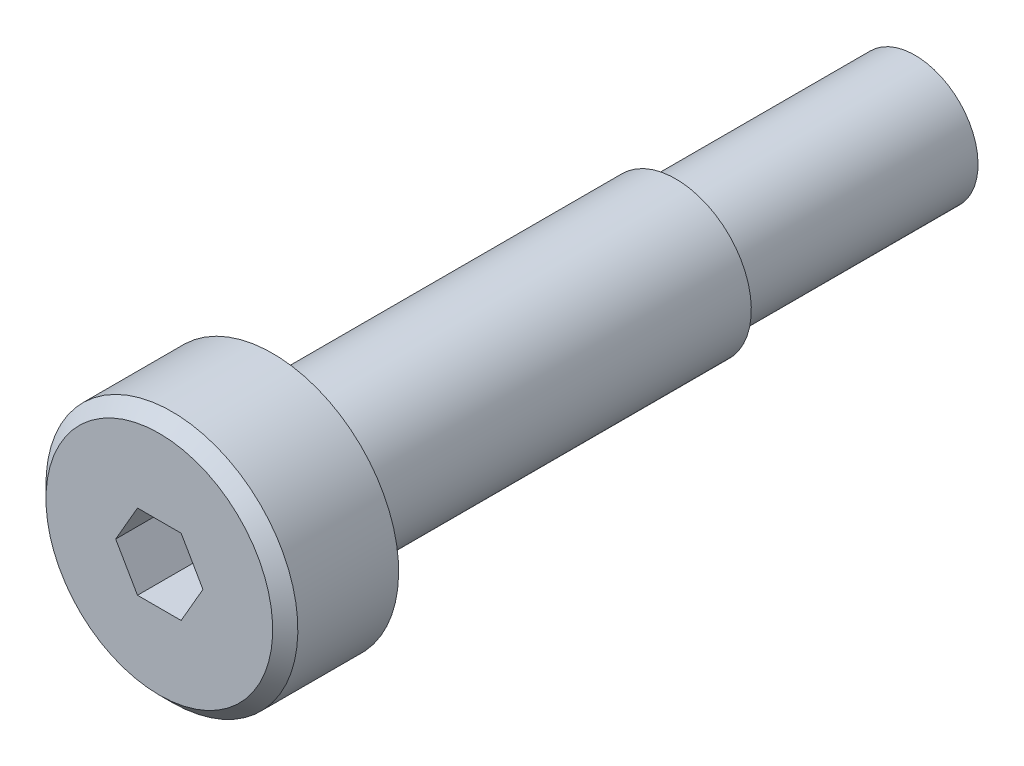
ISO-10303-21;
HEADER;
FILE_DESCRIPTION(('STEP AP214'),'2;1');
FILE_NAME('part.step','',(''),(''),'','','');
FILE_SCHEMA(('AUTOMOTIVE_DESIGN { 1 0 10303 214 1 1 1 1 }'));
ENDSEC;
DATA;
#1=APPLICATION_CONTEXT('core data for automotive mechanical design processes');
#2=APPLICATION_PROTOCOL_DEFINITION('international standard','automotive_design',2000,#1);
#3=PRODUCT_CONTEXT('',#1,'mechanical');
#4=PRODUCT('Part','Part','',(#3));
#5=PRODUCT_RELATED_PRODUCT_CATEGORY('part','',(#4));
#6=PRODUCT_DEFINITION_FORMATION('','',#4);
#7=PRODUCT_DEFINITION_CONTEXT('part definition',#1,'design');
#8=PRODUCT_DEFINITION('design','',#6,#7);
#9=PRODUCT_DEFINITION_SHAPE('','',#8);
#10=(LENGTH_UNIT() NAMED_UNIT(*) SI_UNIT(.MILLI.,.METRE.));
#11=(NAMED_UNIT(*) PLANE_ANGLE_UNIT() SI_UNIT($,.RADIAN.));
#12=(NAMED_UNIT(*) SI_UNIT($,.STERADIAN.) SOLID_ANGLE_UNIT());
#13=UNCERTAINTY_MEASURE_WITH_UNIT(LENGTH_MEASURE(1.E-05),#10,'distance_accuracy_value','');
#14=(GEOMETRIC_REPRESENTATION_CONTEXT(3) GLOBAL_UNCERTAINTY_ASSIGNED_CONTEXT((#13)) GLOBAL_UNIT_ASSIGNED_CONTEXT((#10,
#11,#12)) REPRESENTATION_CONTEXT('',''));
#15=CARTESIAN_POINT('',(0.,0.,0.));
#16=DIRECTION('',(0.,0.,1.));
#17=DIRECTION('',(1.,0.,0.));
#18=AXIS2_PLACEMENT_3D('',#15,#16,#17);
#19=CARTESIAN_POINT('',(0.,0.,20.));
#20=DIRECTION('',(0.,0.,-1.));
#21=DIRECTION('',(0.,1.,0.));
#22=AXIS2_PLACEMENT_3D('',#19,#20,#21);
#23=CONICAL_SURFACE('',#22,5.,0.78539816339745);
#24=CARTESIAN_POINT('',(0.,0.,20.5));
#25=DIRECTION('',(0.,0.,1.));
#26=DIRECTION('',(0.,-1.,0.));
#27=AXIS2_PLACEMENT_3D('',#24,#25,#26);
#28=CIRCLE('',#27,4.5);
#29=CARTESIAN_POINT('',(0.,-4.5,20.5));
#30=VERTEX_POINT('',#29);
#31=EDGE_CURVE('E11',#30,#30,#28,.T.);
#32=ORIENTED_EDGE('',*,*,#31,.F.);
#33=EDGE_LOOP('',(#32));
#34=FACE_BOUND('',#33,.T.);
#35=CARTESIAN_POINT('',(0.,0.,20.));
#36=DIRECTION('',(0.,0.,1.));
#37=DIRECTION('',(0.,-1.,0.));
#38=AXIS2_PLACEMENT_3D('',#35,#36,#37);
#39=CIRCLE('',#38,5.);
#40=CARTESIAN_POINT('',(0.,-5.00000000000001,20.));
#41=VERTEX_POINT('',#40);
#42=EDGE_CURVE('E137',#41,#41,#39,.T.);
#43=ORIENTED_EDGE('',*,*,#42,.T.);
#44=EDGE_LOOP('',(#43));
#45=FACE_BOUND('',#44,.T.);
#46=ADVANCED_FACE('F36',(#34,#45),#23,.T.);
#47=CARTESIAN_POINT('',(0.,4.5,20.5));
#48=DIRECTION('',(0.,0.,-1.));
#49=DIRECTION('',(0.,1.,0.));
#50=AXIS2_PLACEMENT_3D('',#47,#48,#49);
#51=PLANE('',#50);
#52=DIRECTION('',(0.5,0.866025403784439,0.));
#53=VECTOR('',#52,1.);
#54=CARTESIAN_POINT('',(0.866025403784439,-1.5,20.5));
#55=LINE('',#54,#53);
#56=CARTESIAN_POINT('',(0.866025403784439,-1.5,20.5));
#57=VERTEX_POINT('',#56);
#58=CARTESIAN_POINT('',(1.73205080756888,0.,20.5));
#59=VERTEX_POINT('',#58);
#60=EDGE_CURVE('E124',#57,#59,#55,.T.);
#61=ORIENTED_EDGE('',*,*,#60,.F.);
#62=DIRECTION('',(1.,0.,0.));
#63=VECTOR('',#62,1.);
#64=CARTESIAN_POINT('',(-0.866025403784438,-1.5,20.5));
#65=LINE('',#64,#63);
#66=CARTESIAN_POINT('',(-0.866025403784438,-1.5,20.5));
#67=VERTEX_POINT('',#66);
#68=EDGE_CURVE('E50',#67,#57,#65,.T.);
#69=ORIENTED_EDGE('',*,*,#68,.F.);
#70=DIRECTION('',(0.5,-0.866025403784439,0.));
#71=VECTOR('',#70,1.);
#72=CARTESIAN_POINT('',(-1.73205080756888,0.,20.5));
#73=LINE('',#72,#71);
#74=CARTESIAN_POINT('',(-1.73205080756888,0.,20.5));
#75=VERTEX_POINT('',#74);
#76=EDGE_CURVE('E133',#75,#67,#73,.T.);
#77=ORIENTED_EDGE('',*,*,#76,.F.);
#78=DIRECTION('',(-0.5,-0.866025403784439,0.));
#79=VECTOR('',#78,1.);
#80=CARTESIAN_POINT('',(-0.866025403784439,1.5,20.5));
#81=LINE('',#80,#79);
#82=CARTESIAN_POINT('',(-0.866025403784439,1.5,20.5));
#83=VERTEX_POINT('',#82);
#84=EDGE_CURVE('E131',#83,#75,#81,.T.);
#85=ORIENTED_EDGE('',*,*,#84,.F.);
#86=DIRECTION('',(-1.,0.,0.));
#87=VECTOR('',#86,1.);
#88=CARTESIAN_POINT('',(0.866025403784439,1.5,20.5));
#89=LINE('',#88,#87);
#90=CARTESIAN_POINT('',(0.866025403784439,1.5,20.5));
#91=VERTEX_POINT('',#90);
#92=EDGE_CURVE('E98',#91,#83,#89,.T.);
#93=ORIENTED_EDGE('',*,*,#92,.F.);
#94=DIRECTION('',(-0.5,0.866025403784439,0.));
#95=VECTOR('',#94,1.);
#96=CARTESIAN_POINT('',(1.73205080756888,0.,20.5));
#97=LINE('',#96,#95);
#98=EDGE_CURVE('E127',#59,#91,#97,.T.);
#99=ORIENTED_EDGE('',*,*,#98,.F.);
#100=EDGE_LOOP('',(#61,#69,#77,#85,#93,#99));
#101=FACE_BOUND('',#100,.T.);
#102=ORIENTED_EDGE('',*,*,#31,.T.);
#103=EDGE_LOOP('',(#102));
#104=FACE_BOUND('',#103,.T.);
#105=ADVANCED_FACE('F163',(#101,#104),#51,.F.);
#106=CARTESIAN_POINT('',(0.,2.5,-9.5));
#107=DIRECTION('',(0.,0.,1.));
#108=DIRECTION('',(0.,-1.,0.));
#109=AXIS2_PLACEMENT_3D('',#106,#107,#108);
#110=PLANE('',#109);
#111=CARTESIAN_POINT('',(0.,0.,-9.5));
#112=DIRECTION('',(0.,0.,1.));
#113=DIRECTION('',(0.,-1.,0.));
#114=AXIS2_PLACEMENT_3D('',#111,#112,#113);
#115=CIRCLE('',#114,2.5);
#116=CARTESIAN_POINT('',(0.,-2.5,-9.5));
#117=VERTEX_POINT('',#116);
#118=EDGE_CURVE('E43',#117,#117,#115,.T.);
#119=ORIENTED_EDGE('',*,*,#118,.F.);
#120=EDGE_LOOP('',(#119));
#121=FACE_BOUND('',#120,.T.);
#122=ADVANCED_FACE('F161',(#121),#110,.F.);
#123=CARTESIAN_POINT('',(0.,0.,5.58488227818494));
#124=DIRECTION('',(0.,0.,1.));
#125=DIRECTION('',(0.,-1.,0.));
#126=AXIS2_PLACEMENT_3D('',#123,#124,#125);
#127=CYLINDRICAL_SURFACE('',#126,2.5);
#128=CARTESIAN_POINT('',(0.,0.,0.));
#129=DIRECTION('',(0.,0.,1.));
#130=DIRECTION('',(0.,-1.,0.));
#131=AXIS2_PLACEMENT_3D('',#128,#129,#130);
#132=CIRCLE('',#131,2.5);
#133=CARTESIAN_POINT('',(0.,-2.5,0.));
#134=VERTEX_POINT('',#133);
#135=EDGE_CURVE('E154',#134,#134,#132,.T.);
#136=ORIENTED_EDGE('',*,*,#135,.F.);
#137=EDGE_LOOP('',(#136));
#138=FACE_BOUND('',#137,.T.);
#139=ORIENTED_EDGE('',*,*,#118,.T.);
#140=EDGE_LOOP('',(#139));
#141=FACE_BOUND('',#140,.T.);
#142=ADVANCED_FACE('F159',(#138,#141),#127,.T.);
#143=CARTESIAN_POINT('',(0.,3.,0.));
#144=DIRECTION('',(0.,0.,1.));
#145=DIRECTION('',(0.,-1.,0.));
#146=AXIS2_PLACEMENT_3D('',#143,#144,#145);
#147=PLANE('',#146);
#148=CARTESIAN_POINT('',(0.,0.,0.));
#149=DIRECTION('',(0.,0.,1.));
#150=DIRECTION('',(0.,-1.,0.));
#151=AXIS2_PLACEMENT_3D('',#148,#149,#150);
#152=CIRCLE('',#151,3.);
#153=CARTESIAN_POINT('',(0.,-3.,0.));
#154=VERTEX_POINT('',#153);
#155=EDGE_CURVE('E151',#154,#154,#152,.T.);
#156=ORIENTED_EDGE('',*,*,#155,.F.);
#157=EDGE_LOOP('',(#156));
#158=FACE_BOUND('',#157,.T.);
#159=ORIENTED_EDGE('',*,*,#135,.T.);
#160=EDGE_LOOP('',(#159));
#161=FACE_BOUND('',#160,.T.);
#162=ADVANCED_FACE('F169',(#158,#161),#147,.F.);
#163=CARTESIAN_POINT('',(0.,0.,5.58488227818494));
#164=DIRECTION('',(0.,0.,1.));
#165=DIRECTION('',(0.,-1.,0.));
#166=AXIS2_PLACEMENT_3D('',#163,#164,#165);
#167=CYLINDRICAL_SURFACE('',#166,3.);
#168=CARTESIAN_POINT('',(0.,0.,16.));
#169=DIRECTION('',(0.,0.,1.));
#170=DIRECTION('',(0.,-1.,0.));
#171=AXIS2_PLACEMENT_3D('',#168,#169,#170);
#172=CIRCLE('',#171,3.);
#173=CARTESIAN_POINT('',(0.,-3.00000000000001,16.));
#174=VERTEX_POINT('',#173);
#175=EDGE_CURVE('E148',#174,#174,#172,.T.);
#176=ORIENTED_EDGE('',*,*,#175,.F.);
#177=EDGE_LOOP('',(#176));
#178=FACE_BOUND('',#177,.T.);
#179=ORIENTED_EDGE('',*,*,#155,.T.);
#180=EDGE_LOOP('',(#179));
#181=FACE_BOUND('',#180,.T.);
#182=ADVANCED_FACE('F191',(#178,#181),#167,.T.);
#183=CARTESIAN_POINT('',(0.,3.,16.));
#184=DIRECTION('',(0.,0.,1.));
#185=DIRECTION('',(0.,-1.,0.));
#186=AXIS2_PLACEMENT_3D('',#183,#184,#185);
#187=PLANE('',#186);
#188=CARTESIAN_POINT('',(0.,0.,16.));
#189=DIRECTION('',(0.,0.,1.));
#190=DIRECTION('',(0.,-1.,0.));
#191=AXIS2_PLACEMENT_3D('',#188,#189,#190);
#192=CIRCLE('',#191,5.);
#193=CARTESIAN_POINT('',(0.,-5.,16.));
#194=VERTEX_POINT('',#193);
#195=EDGE_CURVE('E145',#194,#194,#192,.T.);
#196=ORIENTED_EDGE('',*,*,#195,.F.);
#197=EDGE_LOOP('',(#196));
#198=FACE_BOUND('',#197,.T.);
#199=ORIENTED_EDGE('',*,*,#175,.T.);
#200=EDGE_LOOP('',(#199));
#201=FACE_BOUND('',#200,.T.);
#202=ADVANCED_FACE('F185',(#198,#201),#187,.F.);
#203=CARTESIAN_POINT('',(0.,0.,5.58488227818494));
#204=DIRECTION('',(0.,0.,1.));
#205=DIRECTION('',(0.,-1.,0.));
#206=AXIS2_PLACEMENT_3D('',#203,#204,#205);
#207=CYLINDRICAL_SURFACE('',#206,5.);
#208=ORIENTED_EDGE('',*,*,#42,.F.);
#209=EDGE_LOOP('',(#208));
#210=FACE_BOUND('',#209,.T.);
#211=ORIENTED_EDGE('',*,*,#195,.T.);
#212=EDGE_LOOP('',(#211));
#213=FACE_BOUND('',#212,.T.);
#214=ADVANCED_FACE('F181',(#210,#213),#207,.T.);
#215=CARTESIAN_POINT('',(-0.866025403784438,-1.5,17.8));
#216=DIRECTION('',(0.,-1.,0.));
#217=DIRECTION('',(1.,0.,0.));
#218=AXIS2_PLACEMENT_3D('',#215,#216,#217);
#219=PLANE('',#218);
#220=ORIENTED_EDGE('',*,*,#68,.T.);
#221=DIRECTION('',(0.,0.,1.));
#222=VECTOR('',#221,1.);
#223=CARTESIAN_POINT('',(0.866025403784439,-1.5,17.8));
#224=LINE('',#223,#222);
#225=CARTESIAN_POINT('',(0.866025403784439,-1.5,17.8));
#226=VERTEX_POINT('',#225);
#227=EDGE_CURVE('E80',#226,#57,#224,.T.);
#228=ORIENTED_EDGE('',*,*,#227,.F.);
#229=DIRECTION('',(1.,0.,0.));
#230=VECTOR('',#229,1.);
#231=CARTESIAN_POINT('',(-0.866025403784438,-1.5,17.8));
#232=LINE('',#231,#230);
#233=CARTESIAN_POINT('',(-0.866025403784438,-1.5,17.8));
#234=VERTEX_POINT('',#233);
#235=EDGE_CURVE('E135',#234,#226,#232,.T.);
#236=ORIENTED_EDGE('',*,*,#235,.F.);
#237=DIRECTION('',(0.,0.,1.));
#238=VECTOR('',#237,1.);
#239=CARTESIAN_POINT('',(-0.866025403784438,-1.5,17.8));
#240=LINE('',#239,#238);
#241=EDGE_CURVE('E58',#234,#67,#240,.T.);
#242=ORIENTED_EDGE('',*,*,#241,.T.);
#243=EDGE_LOOP('',(#220,#228,#236,#242));
#244=FACE_BOUND('',#243,.T.);
#245=ADVANCED_FACE('F184',(#244),#219,.F.);
#246=CARTESIAN_POINT('',(-1.73205080756888,0.,17.8));
#247=DIRECTION('',(-0.866025403784439,-0.5,0.));
#248=DIRECTION('',(0.5,-0.866025403784439,0.));
#249=AXIS2_PLACEMENT_3D('',#246,#247,#248);
#250=PLANE('',#249);
#251=ORIENTED_EDGE('',*,*,#76,.T.);
#252=ORIENTED_EDGE('',*,*,#241,.F.);
#253=DIRECTION('',(0.5,-0.866025403784439,0.));
#254=VECTOR('',#253,1.);
#255=CARTESIAN_POINT('',(-1.73205080756888,0.,17.8));
#256=LINE('',#255,#254);
#257=CARTESIAN_POINT('',(-1.73205080756888,0.,17.8));
#258=VERTEX_POINT('',#257);
#259=EDGE_CURVE('E110',#258,#234,#256,.T.);
#260=ORIENTED_EDGE('',*,*,#259,.F.);
#261=DIRECTION('',(0.,0.,1.));
#262=VECTOR('',#261,1.);
#263=CARTESIAN_POINT('',(-1.73205080756888,0.,17.8));
#264=LINE('',#263,#262);
#265=EDGE_CURVE('E102',#258,#75,#264,.T.);
#266=ORIENTED_EDGE('',*,*,#265,.T.);
#267=EDGE_LOOP('',(#251,#252,#260,#266));
#268=FACE_BOUND('',#267,.T.);
#269=ADVANCED_FACE('F209',(#268),#250,.F.);
#270=CARTESIAN_POINT('',(-0.866025403784439,1.5,17.8));
#271=DIRECTION('',(-0.866025403784439,0.5,0.));
#272=DIRECTION('',(-0.5,-0.866025403784439,0.));
#273=AXIS2_PLACEMENT_3D('',#270,#271,#272);
#274=PLANE('',#273);
#275=ORIENTED_EDGE('',*,*,#84,.T.);
#276=ORIENTED_EDGE('',*,*,#265,.F.);
#277=DIRECTION('',(-0.5,-0.866025403784439,0.));
#278=VECTOR('',#277,1.);
#279=CARTESIAN_POINT('',(-0.866025403784439,1.5,17.8));
#280=LINE('',#279,#278);
#281=CARTESIAN_POINT('',(-0.866025403784439,1.5,17.8));
#282=VERTEX_POINT('',#281);
#283=EDGE_CURVE('E106',#282,#258,#280,.T.);
#284=ORIENTED_EDGE('',*,*,#283,.F.);
#285=DIRECTION('',(0.,0.,1.));
#286=VECTOR('',#285,1.);
#287=CARTESIAN_POINT('',(-0.866025403784439,1.5,17.8));
#288=LINE('',#287,#286);
#289=EDGE_CURVE('E91',#282,#83,#288,.T.);
#290=ORIENTED_EDGE('',*,*,#289,.T.);
#291=EDGE_LOOP('',(#275,#276,#284,#290));
#292=FACE_BOUND('',#291,.T.);
#293=ADVANCED_FACE('F107',(#292),#274,.F.);
#294=CARTESIAN_POINT('',(0.866025403784439,1.5,17.8));
#295=DIRECTION('',(0.,1.,0.));
#296=DIRECTION('',(0.,0.,1.));
#297=AXIS2_PLACEMENT_3D('',#294,#295,#296);
#298=PLANE('',#297);
#299=ORIENTED_EDGE('',*,*,#92,.T.);
#300=ORIENTED_EDGE('',*,*,#289,.F.);
#301=DIRECTION('',(-1.,0.,0.));
#302=VECTOR('',#301,1.);
#303=CARTESIAN_POINT('',(0.866025403784439,1.5,17.8));
#304=LINE('',#303,#302);
#305=CARTESIAN_POINT('',(0.866025403784439,1.5,17.8));
#306=VERTEX_POINT('',#305);
#307=EDGE_CURVE('E95',#306,#282,#304,.T.);
#308=ORIENTED_EDGE('',*,*,#307,.F.);
#309=DIRECTION('',(0.,0.,1.));
#310=VECTOR('',#309,1.);
#311=CARTESIAN_POINT('',(0.866025403784439,1.5,17.8));
#312=LINE('',#311,#310);
#313=EDGE_CURVE('E103',#306,#91,#312,.T.);
#314=ORIENTED_EDGE('',*,*,#313,.T.);
#315=EDGE_LOOP('',(#299,#300,#308,#314));
#316=FACE_BOUND('',#315,.T.);
#317=ADVANCED_FACE('F93',(#316),#298,.F.);
#318=CARTESIAN_POINT('',(1.73205080756888,0.,17.8));
#319=DIRECTION('',(0.866025403784439,0.5,0.));
#320=DIRECTION('',(-0.5,0.866025403784439,0.));
#321=AXIS2_PLACEMENT_3D('',#318,#319,#320);
#322=PLANE('',#321);
#323=ORIENTED_EDGE('',*,*,#98,.T.);
#324=ORIENTED_EDGE('',*,*,#313,.F.);
#325=DIRECTION('',(-0.5,0.866025403784439,0.));
#326=VECTOR('',#325,1.);
#327=CARTESIAN_POINT('',(1.73205080756888,0.,17.8));
#328=LINE('',#327,#326);
#329=CARTESIAN_POINT('',(1.73205080756888,0.,17.8));
#330=VERTEX_POINT('',#329);
#331=EDGE_CURVE('E116',#330,#306,#328,.T.);
#332=ORIENTED_EDGE('',*,*,#331,.F.);
#333=DIRECTION('',(0.,0.,1.));
#334=VECTOR('',#333,1.);
#335=CARTESIAN_POINT('',(1.73205080756888,0.,17.8));
#336=LINE('',#335,#334);
#337=EDGE_CURVE('E140',#330,#59,#336,.T.);
#338=ORIENTED_EDGE('',*,*,#337,.T.);
#339=EDGE_LOOP('',(#323,#324,#332,#338));
#340=FACE_BOUND('',#339,.T.);
#341=ADVANCED_FACE('F213',(#340),#322,.F.);
#342=CARTESIAN_POINT('',(0.866025403784439,-1.5,17.8));
#343=DIRECTION('',(0.866025403784439,-0.5,0.));
#344=DIRECTION('',(0.5,0.866025403784439,0.));
#345=AXIS2_PLACEMENT_3D('',#342,#343,#344);
#346=PLANE('',#345);
#347=ORIENTED_EDGE('',*,*,#60,.T.);
#348=ORIENTED_EDGE('',*,*,#337,.F.);
#349=DIRECTION('',(0.5,0.866025403784439,0.));
#350=VECTOR('',#349,1.);
#351=CARTESIAN_POINT('',(0.866025403784439,-1.5,17.8));
#352=LINE('',#351,#350);
#353=EDGE_CURVE('E118',#226,#330,#352,.T.);
#354=ORIENTED_EDGE('',*,*,#353,.F.);
#355=ORIENTED_EDGE('',*,*,#227,.T.);
#356=EDGE_LOOP('',(#347,#348,#354,#355));
#357=FACE_BOUND('',#356,.T.);
#358=ADVANCED_FACE('F210',(#357),#346,.F.);
#359=CARTESIAN_POINT('',(-0.866025403784439,-1.5,17.8));
#360=DIRECTION('',(0.,0.,-1.));
#361=DIRECTION('',(-1.,0.,0.));
#362=AXIS2_PLACEMENT_3D('',#359,#360,#361);
#363=PLANE('',#362);
#364=ORIENTED_EDGE('',*,*,#235,.T.);
#365=ORIENTED_EDGE('',*,*,#353,.T.);
#366=ORIENTED_EDGE('',*,*,#331,.T.);
#367=ORIENTED_EDGE('',*,*,#307,.T.);
#368=ORIENTED_EDGE('',*,*,#283,.T.);
#369=ORIENTED_EDGE('',*,*,#259,.T.);
#370=EDGE_LOOP('',(#364,#365,#366,#367,#368,#369));
#371=FACE_BOUND('',#370,.T.);
#372=ADVANCED_FACE('F113',(#371),#363,.F.);
#373=CLOSED_SHELL('',(#46,#105,#122,#142,#162,#182,#202,#214,#245,#269,#293,#317,#341,#358,#372));
#374=MANIFOLD_SOLID_BREP('B2',#373);
#375=ADVANCED_BREP_SHAPE_REPRESENTATION('',(#18,#374),#14);
#376=SHAPE_DEFINITION_REPRESENTATION(#9,#375);
ENDSEC;
END-ISO-10303-21;
